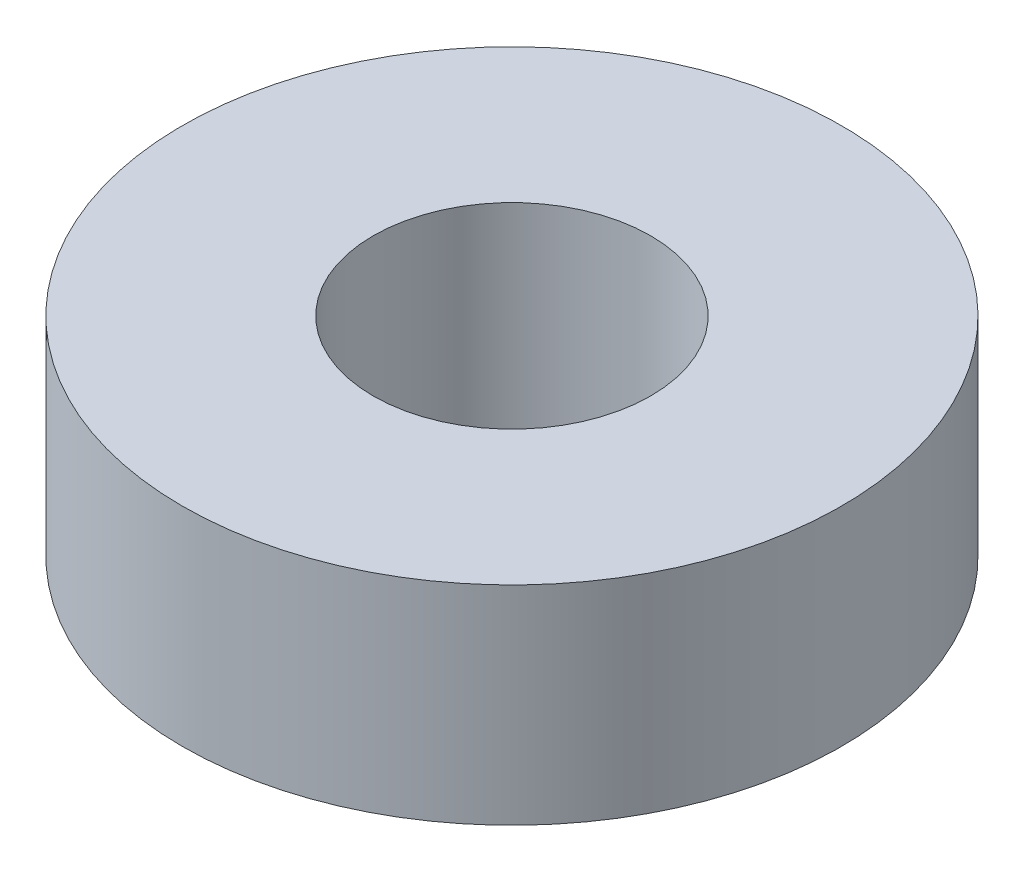
ISO-10303-21;
HEADER;
FILE_DESCRIPTION(('STEP AP214'),'2;1');
FILE_NAME('part.step','',(''),(''),'','','');
FILE_SCHEMA(('AUTOMOTIVE_DESIGN { 1 0 10303 214 1 1 1 1 }'));
ENDSEC;
DATA;
#1=APPLICATION_CONTEXT('core data for automotive mechanical design processes');
#2=APPLICATION_PROTOCOL_DEFINITION('international standard','automotive_design',2000,#1);
#3=PRODUCT_CONTEXT('',#1,'mechanical');
#4=PRODUCT('Part','Part','',(#3));
#5=PRODUCT_RELATED_PRODUCT_CATEGORY('part','',(#4));
#6=PRODUCT_DEFINITION_FORMATION('','',#4);
#7=PRODUCT_DEFINITION_CONTEXT('part definition',#1,'design');
#8=PRODUCT_DEFINITION('design','',#6,#7);
#9=PRODUCT_DEFINITION_SHAPE('','',#8);
#10=(LENGTH_UNIT() NAMED_UNIT(*) SI_UNIT(.MILLI.,.METRE.));
#11=(NAMED_UNIT(*) PLANE_ANGLE_UNIT() SI_UNIT($,.RADIAN.));
#12=(NAMED_UNIT(*) SI_UNIT($,.STERADIAN.) SOLID_ANGLE_UNIT());
#13=UNCERTAINTY_MEASURE_WITH_UNIT(LENGTH_MEASURE(1.E-05),#10,'distance_accuracy_value','');
#14=(GEOMETRIC_REPRESENTATION_CONTEXT(3) GLOBAL_UNCERTAINTY_ASSIGNED_CONTEXT((#13)) GLOBAL_UNIT_ASSIGNED_CONTEXT((#10,
#11,#12)) REPRESENTATION_CONTEXT('',''));
#15=CARTESIAN_POINT('',(0.,0.,0.));
#16=DIRECTION('',(0.,0.,1.));
#17=DIRECTION('',(1.,0.,0.));
#18=AXIS2_PLACEMENT_3D('',#15,#16,#17);
#19=CARTESIAN_POINT('',(0.,3.,0.));
#20=DIRECTION('',(0.,1.,0.));
#21=DIRECTION('',(0.,0.,1.));
#22=AXIS2_PLACEMENT_3D('',#19,#20,#21);
#23=PLANE('',#22);
#24=CARTESIAN_POINT('',(0.,3.,0.));
#25=DIRECTION('',(0.,1.,0.));
#26=DIRECTION('',(0.,0.,1.));
#27=AXIS2_PLACEMENT_3D('',#24,#25,#26);
#28=CIRCLE('',#27,4.75);
#29=CARTESIAN_POINT('',(0.,3.,4.75));
#30=VERTEX_POINT('',#29);
#31=EDGE_CURVE('E10',#30,#30,#28,.T.);
#32=ORIENTED_EDGE('',*,*,#31,.T.);
#33=EDGE_LOOP('',(#32));
#34=FACE_BOUND('',#33,.T.);
#35=CARTESIAN_POINT('',(0.,3.,0.));
#36=DIRECTION('',(0.,1.,0.));
#37=DIRECTION('',(0.,0.,1.));
#38=AXIS2_PLACEMENT_3D('',#35,#36,#37);
#39=CIRCLE('',#38,2.);
#40=CARTESIAN_POINT('',(0.,3.,2.));
#41=VERTEX_POINT('',#40);
#42=EDGE_CURVE('E46',#41,#41,#39,.T.);
#43=ORIENTED_EDGE('',*,*,#42,.F.);
#44=EDGE_LOOP('',(#43));
#45=FACE_BOUND('',#44,.T.);
#46=ADVANCED_FACE('F35',(#34,#45),#23,.T.);
#47=CARTESIAN_POINT('',(0.,0.,0.));
#48=DIRECTION('',(0.,1.,0.));
#49=DIRECTION('',(0.,0.,1.));
#50=AXIS2_PLACEMENT_3D('',#47,#48,#49);
#51=PLANE('',#50);
#52=CARTESIAN_POINT('',(0.,0.,0.));
#53=DIRECTION('',(0.,1.,0.));
#54=DIRECTION('',(0.,0.,1.));
#55=AXIS2_PLACEMENT_3D('',#52,#53,#54);
#56=CIRCLE('',#55,4.75);
#57=CARTESIAN_POINT('',(0.,0.,4.75));
#58=VERTEX_POINT('',#57);
#59=EDGE_CURVE('E39',#58,#58,#56,.T.);
#60=ORIENTED_EDGE('',*,*,#59,.F.);
#61=EDGE_LOOP('',(#60));
#62=FACE_BOUND('',#61,.T.);
#63=CARTESIAN_POINT('',(0.,0.,0.));
#64=DIRECTION('',(0.,1.,0.));
#65=DIRECTION('',(0.,0.,1.));
#66=AXIS2_PLACEMENT_3D('',#63,#64,#65);
#67=CIRCLE('',#66,2.);
#68=CARTESIAN_POINT('',(0.,0.,2.));
#69=VERTEX_POINT('',#68);
#70=EDGE_CURVE('E48',#69,#69,#67,.T.);
#71=ORIENTED_EDGE('',*,*,#70,.T.);
#72=EDGE_LOOP('',(#71));
#73=FACE_BOUND('',#72,.T.);
#74=ADVANCED_FACE('F58',(#62,#73),#51,.F.);
#75=CARTESIAN_POINT('',(0.,3.,0.));
#76=DIRECTION('',(0.,-1.,0.));
#77=DIRECTION('',(0.,0.,-1.));
#78=AXIS2_PLACEMENT_3D('',#75,#76,#77);
#79=CYLINDRICAL_SURFACE('',#78,4.75);
#80=ORIENTED_EDGE('',*,*,#31,.F.);
#81=EDGE_LOOP('',(#80));
#82=FACE_BOUND('',#81,.T.);
#83=ORIENTED_EDGE('',*,*,#59,.T.);
#84=EDGE_LOOP('',(#83));
#85=FACE_BOUND('',#84,.T.);
#86=ADVANCED_FACE('F37',(#82,#85),#79,.T.);
#87=CARTESIAN_POINT('',(0.,3.,0.));
#88=DIRECTION('',(0.,-1.,0.));
#89=DIRECTION('',(0.,0.,-1.));
#90=AXIS2_PLACEMENT_3D('',#87,#88,#89);
#91=CYLINDRICAL_SURFACE('',#90,2.);
#92=ORIENTED_EDGE('',*,*,#42,.T.);
#93=EDGE_LOOP('',(#92));
#94=FACE_BOUND('',#93,.T.);
#95=ORIENTED_EDGE('',*,*,#70,.F.);
#96=EDGE_LOOP('',(#95));
#97=FACE_BOUND('',#96,.T.);
#98=ADVANCED_FACE('F54',(#94,#97),#91,.F.);
#99=CLOSED_SHELL('',(#46,#74,#86,#98));
#100=MANIFOLD_SOLID_BREP('B2',#99);
#101=ADVANCED_BREP_SHAPE_REPRESENTATION('',(#18,#100),#14);
#102=SHAPE_DEFINITION_REPRESENTATION(#9,#101);
ENDSEC;
END-ISO-10303-21;
